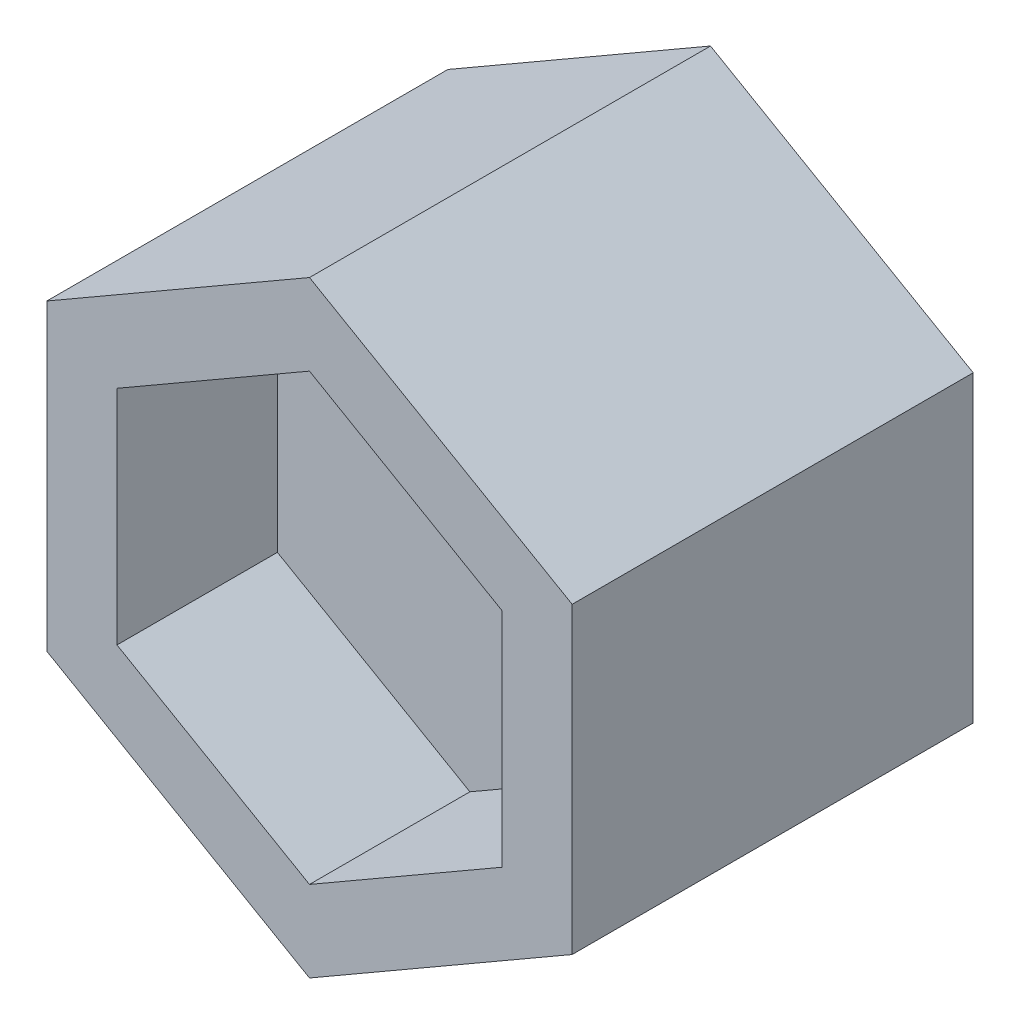
ISO-10303-21;
HEADER;
FILE_DESCRIPTION(('STEP AP214'),'2;1');
FILE_NAME('part.step','',(''),(''),'','','');
FILE_SCHEMA(('AUTOMOTIVE_DESIGN { 1 0 10303 214 1 1 1 1 }'));
ENDSEC;
DATA;
#1=APPLICATION_CONTEXT('core data for automotive mechanical design processes');
#2=APPLICATION_PROTOCOL_DEFINITION('international standard','automotive_design',2000,#1);
#3=PRODUCT_CONTEXT('',#1,'mechanical');
#4=PRODUCT('Part','Part','',(#3));
#5=PRODUCT_RELATED_PRODUCT_CATEGORY('part','',(#4));
#6=PRODUCT_DEFINITION_FORMATION('','',#4);
#7=PRODUCT_DEFINITION_CONTEXT('part definition',#1,'design');
#8=PRODUCT_DEFINITION('design','',#6,#7);
#9=PRODUCT_DEFINITION_SHAPE('','',#8);
#10=(LENGTH_UNIT() NAMED_UNIT(*) SI_UNIT(.MILLI.,.METRE.));
#11=(NAMED_UNIT(*) PLANE_ANGLE_UNIT() SI_UNIT($,.RADIAN.));
#12=(NAMED_UNIT(*) SI_UNIT($,.STERADIAN.) SOLID_ANGLE_UNIT());
#13=UNCERTAINTY_MEASURE_WITH_UNIT(LENGTH_MEASURE(1.E-05),#10,'distance_accuracy_value','');
#14=(GEOMETRIC_REPRESENTATION_CONTEXT(3) GLOBAL_UNCERTAINTY_ASSIGNED_CONTEXT((#13)) GLOBAL_UNIT_ASSIGNED_CONTEXT((#10,
#11,#12)) REPRESENTATION_CONTEXT('',''));
#15=CARTESIAN_POINT('',(0.,0.,0.));
#16=DIRECTION('',(0.,0.,1.));
#17=DIRECTION('',(1.,0.,0.));
#18=AXIS2_PLACEMENT_3D('',#15,#16,#17);
#19=CARTESIAN_POINT('',(0.,11.0851251684408,-10.));
#20=DIRECTION('',(-0.5,0.866025403784438,0.));
#21=DIRECTION('',(-0.866025403784439,-0.5,0.));
#22=AXIS2_PLACEMENT_3D('',#19,#20,#21);
#23=PLANE('',#22);
#24=DIRECTION('',(0.866025403784439,0.5,0.));
#25=VECTOR('',#24,1.);
#26=CARTESIAN_POINT('',(0.,11.0851251684408,-2.));
#27=LINE('',#26,#25);
#28=CARTESIAN_POINT('',(-9.6,5.5425625842204,-2.));
#29=VERTEX_POINT('',#28);
#30=CARTESIAN_POINT('',(0.,11.0851251684408,-2.));
#31=VERTEX_POINT('',#30);
#32=EDGE_CURVE('E310',#29,#31,#27,.T.);
#33=ORIENTED_EDGE('',*,*,#32,.F.);
#34=DIRECTION('',(0.,0.,1.));
#35=VECTOR('',#34,1.);
#36=CARTESIAN_POINT('',(-9.6,5.5425625842204,-10.));
#37=LINE('',#36,#35);
#38=CARTESIAN_POINT('',(-9.6,5.5425625842204,-10.));
#39=VERTEX_POINT('',#38);
#40=EDGE_CURVE('E188',#39,#29,#37,.T.);
#41=ORIENTED_EDGE('',*,*,#40,.F.);
#42=DIRECTION('',(-0.866025403784438,-0.5,0.));
#43=VECTOR('',#42,1.);
#44=CARTESIAN_POINT('',(0.,11.0851251684408,-10.));
#45=LINE('',#44,#43);
#46=CARTESIAN_POINT('',(0.,11.0851251684408,-10.));
#47=VERTEX_POINT('',#46);
#48=EDGE_CURVE('E262',#47,#39,#45,.T.);
#49=ORIENTED_EDGE('',*,*,#48,.F.);
#50=DIRECTION('',(0.,0.,1.));
#51=VECTOR('',#50,1.);
#52=CARTESIAN_POINT('',(0.,11.0851251684408,-10.));
#53=LINE('',#52,#51);
#54=EDGE_CURVE('E201',#47,#31,#53,.T.);
#55=ORIENTED_EDGE('',*,*,#54,.T.);
#56=EDGE_LOOP('',(#33,#41,#49,#55));
#57=FACE_BOUND('',#56,.T.);
#58=ADVANCED_FACE('F39',(#57),#23,.F.);
#59=CARTESIAN_POINT('',(9.6,5.5425625842204,-10.));
#60=DIRECTION('',(0.5,0.866025403784439,0.));
#61=DIRECTION('',(-0.866025403784439,0.5,0.));
#62=AXIS2_PLACEMENT_3D('',#59,#60,#61);
#63=PLANE('',#62);
#64=DIRECTION('',(0.866025403784439,-0.5,0.));
#65=VECTOR('',#64,1.);
#66=CARTESIAN_POINT('',(9.6,5.5425625842204,-2.));
#67=LINE('',#66,#65);
#68=CARTESIAN_POINT('',(9.6,5.5425625842204,-2.));
#69=VERTEX_POINT('',#68);
#70=EDGE_CURVE('E54',#31,#69,#67,.T.);
#71=ORIENTED_EDGE('',*,*,#70,.F.);
#72=ORIENTED_EDGE('',*,*,#54,.F.);
#73=DIRECTION('',(-0.866025403784438,0.5,0.));
#74=VECTOR('',#73,1.);
#75=CARTESIAN_POINT('',(9.6,5.5425625842204,-10.));
#76=LINE('',#75,#74);
#77=CARTESIAN_POINT('',(9.6,5.5425625842204,-10.));
#78=VERTEX_POINT('',#77);
#79=EDGE_CURVE('E277',#78,#47,#76,.T.);
#80=ORIENTED_EDGE('',*,*,#79,.F.);
#81=DIRECTION('',(0.,0.,1.));
#82=VECTOR('',#81,1.);
#83=CARTESIAN_POINT('',(9.6,5.5425625842204,-10.));
#84=LINE('',#83,#82);
#85=EDGE_CURVE('E282',#78,#69,#84,.T.);
#86=ORIENTED_EDGE('',*,*,#85,.T.);
#87=EDGE_LOOP('',(#71,#72,#80,#86));
#88=FACE_BOUND('',#87,.T.);
#89=ADVANCED_FACE('F342',(#88),#63,.F.);
#90=CARTESIAN_POINT('',(9.6,-5.54256258422041,-10.));
#91=DIRECTION('',(1.,0.,0.));
#92=DIRECTION('',(0.,0.,-1.));
#93=AXIS2_PLACEMENT_3D('',#90,#91,#92);
#94=PLANE('',#93);
#95=DIRECTION('',(0.,-1.,0.));
#96=VECTOR('',#95,1.);
#97=CARTESIAN_POINT('',(9.6,-5.54256258422041,-2.));
#98=LINE('',#97,#96);
#99=CARTESIAN_POINT('',(9.6,-5.54256258422041,-2.));
#100=VERTEX_POINT('',#99);
#101=EDGE_CURVE('E62',#69,#100,#98,.T.);
#102=ORIENTED_EDGE('',*,*,#101,.F.);
#103=ORIENTED_EDGE('',*,*,#85,.F.);
#104=DIRECTION('',(0.,1.,0.));
#105=VECTOR('',#104,1.);
#106=CARTESIAN_POINT('',(9.6,-5.54256258422041,-10.));
#107=LINE('',#106,#105);
#108=CARTESIAN_POINT('',(9.6,-5.54256258422041,-10.));
#109=VERTEX_POINT('',#108);
#110=EDGE_CURVE('E274',#109,#78,#107,.T.);
#111=ORIENTED_EDGE('',*,*,#110,.F.);
#112=DIRECTION('',(0.,0.,1.));
#113=VECTOR('',#112,1.);
#114=CARTESIAN_POINT('',(9.6,-5.54256258422041,-10.));
#115=LINE('',#114,#113);
#116=EDGE_CURVE('E284',#109,#100,#115,.T.);
#117=ORIENTED_EDGE('',*,*,#116,.T.);
#118=EDGE_LOOP('',(#102,#103,#111,#117));
#119=FACE_BOUND('',#118,.T.);
#120=ADVANCED_FACE('F353',(#119),#94,.F.);
#121=CARTESIAN_POINT('',(0.,-11.0851251684408,-10.));
#122=DIRECTION('',(0.5,-0.866025403784439,0.));
#123=DIRECTION('',(0.866025403784439,0.5,0.));
#124=AXIS2_PLACEMENT_3D('',#121,#122,#123);
#125=PLANE('',#124);
#126=DIRECTION('',(-0.866025403784439,-0.5,0.));
#127=VECTOR('',#126,1.);
#128=CARTESIAN_POINT('',(0.,-11.0851251684408,-2.));
#129=LINE('',#128,#127);
#130=CARTESIAN_POINT('',(0.,-11.0851251684408,-2.));
#131=VERTEX_POINT('',#130);
#132=EDGE_CURVE('E315',#100,#131,#129,.T.);
#133=ORIENTED_EDGE('',*,*,#132,.F.);
#134=ORIENTED_EDGE('',*,*,#116,.F.);
#135=DIRECTION('',(0.866025403784439,0.5,0.));
#136=VECTOR('',#135,1.);
#137=CARTESIAN_POINT('',(0.,-11.0851251684408,-10.));
#138=LINE('',#137,#136);
#139=CARTESIAN_POINT('',(0.,-11.0851251684408,-10.));
#140=VERTEX_POINT('',#139);
#141=EDGE_CURVE('E271',#140,#109,#138,.T.);
#142=ORIENTED_EDGE('',*,*,#141,.F.);
#143=DIRECTION('',(0.,0.,1.));
#144=VECTOR('',#143,1.);
#145=CARTESIAN_POINT('',(0.,-11.0851251684408,-10.));
#146=LINE('',#145,#144);
#147=EDGE_CURVE('E194',#140,#131,#146,.T.);
#148=ORIENTED_EDGE('',*,*,#147,.T.);
#149=EDGE_LOOP('',(#133,#134,#142,#148));
#150=FACE_BOUND('',#149,.T.);
#151=ADVANCED_FACE('F366',(#150),#125,.F.);
#152=CARTESIAN_POINT('',(-9.6,-5.54256258422041,-10.));
#153=DIRECTION('',(-0.5,-0.866025403784439,0.));
#154=DIRECTION('',(0.866025403784439,-0.5,0.));
#155=AXIS2_PLACEMENT_3D('',#152,#153,#154);
#156=PLANE('',#155);
#157=DIRECTION('',(-0.866025403784439,0.5,0.));
#158=VECTOR('',#157,1.);
#159=CARTESIAN_POINT('',(-9.6,-5.54256258422041,-2.));
#160=LINE('',#159,#158);
#161=CARTESIAN_POINT('',(-9.6,-5.54256258422041,-2.));
#162=VERTEX_POINT('',#161);
#163=EDGE_CURVE('E317',#131,#162,#160,.T.);
#164=ORIENTED_EDGE('',*,*,#163,.F.);
#165=ORIENTED_EDGE('',*,*,#147,.F.);
#166=DIRECTION('',(0.866025403784439,-0.5,0.));
#167=VECTOR('',#166,1.);
#168=CARTESIAN_POINT('',(-9.6,-5.54256258422041,-10.));
#169=LINE('',#168,#167);
#170=CARTESIAN_POINT('',(-9.6,-5.54256258422041,-10.));
#171=VERTEX_POINT('',#170);
#172=EDGE_CURVE('E268',#171,#140,#169,.T.);
#173=ORIENTED_EDGE('',*,*,#172,.F.);
#174=DIRECTION('',(0.,0.,1.));
#175=VECTOR('',#174,1.);
#176=CARTESIAN_POINT('',(-9.6,-5.54256258422041,-10.));
#177=LINE('',#176,#175);
#178=EDGE_CURVE('E187',#171,#162,#177,.T.);
#179=ORIENTED_EDGE('',*,*,#178,.T.);
#180=EDGE_LOOP('',(#164,#165,#173,#179));
#181=FACE_BOUND('',#180,.T.);
#182=ADVANCED_FACE('F363',(#181),#156,.F.);
#183=CARTESIAN_POINT('',(-9.6,5.5425625842204,-10.));
#184=DIRECTION('',(-1.,0.,0.));
#185=DIRECTION('',(0.,0.,1.));
#186=AXIS2_PLACEMENT_3D('',#183,#184,#185);
#187=PLANE('',#186);
#188=DIRECTION('',(0.,1.,0.));
#189=VECTOR('',#188,1.);
#190=CARTESIAN_POINT('',(-9.6,5.5425625842204,-2.));
#191=LINE('',#190,#189);
#192=EDGE_CURVE('E11',#162,#29,#191,.T.);
#193=ORIENTED_EDGE('',*,*,#192,.F.);
#194=ORIENTED_EDGE('',*,*,#178,.F.);
#195=DIRECTION('',(0.,-1.,0.));
#196=VECTOR('',#195,1.);
#197=CARTESIAN_POINT('',(-9.6,5.5425625842204,-10.));
#198=LINE('',#197,#196);
#199=EDGE_CURVE('E265',#39,#171,#198,.T.);
#200=ORIENTED_EDGE('',*,*,#199,.F.);
#201=ORIENTED_EDGE('',*,*,#40,.T.);
#202=EDGE_LOOP('',(#193,#194,#200,#201));
#203=FACE_BOUND('',#202,.T.);
#204=ADVANCED_FACE('F361',(#203),#187,.F.);
#205=CARTESIAN_POINT('',(0.,15.1265770527682,-10.));
#206=DIRECTION('',(-0.5,0.866025403784438,0.));
#207=DIRECTION('',(-0.866025403784439,-0.5,0.));
#208=AXIS2_PLACEMENT_3D('',#205,#206,#207);
#209=PLANE('',#208);
#210=DIRECTION('',(-0.866025403784438,-0.5,0.));
#211=VECTOR('',#210,1.);
#212=CARTESIAN_POINT('',(0.,15.1265770527682,10.));
#213=LINE('',#212,#211);
#214=CARTESIAN_POINT('',(0.,15.1265770527682,10.));
#215=VERTEX_POINT('',#214);
#216=CARTESIAN_POINT('',(-13.1,7.56328852638409,10.));
#217=VERTEX_POINT('',#216);
#218=EDGE_CURVE('E230',#215,#217,#213,.T.);
#219=ORIENTED_EDGE('',*,*,#218,.F.);
#220=DIRECTION('',(0.,0.,1.));
#221=VECTOR('',#220,1.);
#222=CARTESIAN_POINT('',(0.,15.1265770527682,-10.));
#223=LINE('',#222,#221);
#224=CARTESIAN_POINT('',(0.,15.1265770527682,-10.));
#225=VERTEX_POINT('',#224);
#226=EDGE_CURVE('E173',#225,#215,#223,.T.);
#227=ORIENTED_EDGE('',*,*,#226,.F.);
#228=DIRECTION('',(-0.866025403784438,-0.5,0.));
#229=VECTOR('',#228,1.);
#230=CARTESIAN_POINT('',(0.,15.1265770527682,-10.));
#231=LINE('',#230,#229);
#232=CARTESIAN_POINT('',(-13.1,7.56328852638409,-10.));
#233=VERTEX_POINT('',#232);
#234=EDGE_CURVE('E197',#225,#233,#231,.T.);
#235=ORIENTED_EDGE('',*,*,#234,.T.);
#236=DIRECTION('',(0.,0.,1.));
#237=VECTOR('',#236,1.);
#238=CARTESIAN_POINT('',(-13.1,7.56328852638409,-10.));
#239=LINE('',#238,#237);
#240=EDGE_CURVE('E216',#233,#217,#239,.T.);
#241=ORIENTED_EDGE('',*,*,#240,.T.);
#242=EDGE_LOOP('',(#219,#227,#235,#241));
#243=FACE_BOUND('',#242,.T.);
#244=ADVANCED_FACE('F41',(#243),#209,.T.);
#245=CARTESIAN_POINT('',(13.1,7.56328852638409,-10.));
#246=DIRECTION('',(0.5,0.866025403784438,0.));
#247=DIRECTION('',(-0.866025403784439,0.5,0.));
#248=AXIS2_PLACEMENT_3D('',#245,#246,#247);
#249=PLANE('',#248);
#250=DIRECTION('',(-0.866025403784439,0.5,0.));
#251=VECTOR('',#250,1.);
#252=CARTESIAN_POINT('',(13.1,7.56328852638409,10.));
#253=LINE('',#252,#251);
#254=CARTESIAN_POINT('',(13.1,7.56328852638409,10.));
#255=VERTEX_POINT('',#254);
#256=EDGE_CURVE('E247',#255,#215,#253,.T.);
#257=ORIENTED_EDGE('',*,*,#256,.F.);
#258=DIRECTION('',(0.,0.,1.));
#259=VECTOR('',#258,1.);
#260=CARTESIAN_POINT('',(13.1,7.56328852638409,-10.));
#261=LINE('',#260,#259);
#262=CARTESIAN_POINT('',(13.1,7.56328852638409,-10.));
#263=VERTEX_POINT('',#262);
#264=EDGE_CURVE('E218',#263,#255,#261,.T.);
#265=ORIENTED_EDGE('',*,*,#264,.F.);
#266=DIRECTION('',(-0.866025403784439,0.5,0.));
#267=VECTOR('',#266,1.);
#268=CARTESIAN_POINT('',(13.1,7.56328852638409,-10.));
#269=LINE('',#268,#267);
#270=EDGE_CURVE('E213',#263,#225,#269,.T.);
#271=ORIENTED_EDGE('',*,*,#270,.T.);
#272=ORIENTED_EDGE('',*,*,#226,.T.);
#273=EDGE_LOOP('',(#257,#265,#271,#272));
#274=FACE_BOUND('',#273,.T.);
#275=ADVANCED_FACE('F391',(#274),#249,.T.);
#276=CARTESIAN_POINT('',(13.1,-7.5632885263841,-10.));
#277=DIRECTION('',(1.,0.,0.));
#278=DIRECTION('',(0.,0.,-1.));
#279=AXIS2_PLACEMENT_3D('',#276,#277,#278);
#280=PLANE('',#279);
#281=DIRECTION('',(0.,1.,0.));
#282=VECTOR('',#281,1.);
#283=CARTESIAN_POINT('',(13.1,-7.5632885263841,10.));
#284=LINE('',#283,#282);
#285=CARTESIAN_POINT('',(13.1,-7.5632885263841,10.));
#286=VERTEX_POINT('',#285);
#287=EDGE_CURVE('E259',#286,#255,#284,.T.);
#288=ORIENTED_EDGE('',*,*,#287,.F.);
#289=DIRECTION('',(0.,0.,1.));
#290=VECTOR('',#289,1.);
#291=CARTESIAN_POINT('',(13.1,-7.5632885263841,-10.));
#292=LINE('',#291,#290);
#293=CARTESIAN_POINT('',(13.1,-7.5632885263841,-10.));
#294=VERTEX_POINT('',#293);
#295=EDGE_CURVE('E220',#294,#286,#292,.T.);
#296=ORIENTED_EDGE('',*,*,#295,.F.);
#297=DIRECTION('',(0.,1.,0.));
#298=VECTOR('',#297,1.);
#299=CARTESIAN_POINT('',(13.1,-7.5632885263841,-10.));
#300=LINE('',#299,#298);
#301=EDGE_CURVE('E210',#294,#263,#300,.T.);
#302=ORIENTED_EDGE('',*,*,#301,.T.);
#303=ORIENTED_EDGE('',*,*,#264,.T.);
#304=EDGE_LOOP('',(#288,#296,#302,#303));
#305=FACE_BOUND('',#304,.T.);
#306=ADVANCED_FACE('F493',(#305),#280,.T.);
#307=CARTESIAN_POINT('',(0.,-15.1265770527682,-10.));
#308=DIRECTION('',(0.5,-0.866025403784439,0.));
#309=DIRECTION('',(0.866025403784439,0.5,0.));
#310=AXIS2_PLACEMENT_3D('',#307,#308,#309);
#311=PLANE('',#310);
#312=DIRECTION('',(0.866025403784438,0.5,0.));
#313=VECTOR('',#312,1.);
#314=CARTESIAN_POINT('',(0.,-15.1265770527682,10.));
#315=LINE('',#314,#313);
#316=CARTESIAN_POINT('',(0.,-15.1265770527682,10.));
#317=VERTEX_POINT('',#316);
#318=EDGE_CURVE('E256',#317,#286,#315,.T.);
#319=ORIENTED_EDGE('',*,*,#318,.F.);
#320=DIRECTION('',(0.,0.,1.));
#321=VECTOR('',#320,1.);
#322=CARTESIAN_POINT('',(0.,-15.1265770527682,-10.));
#323=LINE('',#322,#321);
#324=CARTESIAN_POINT('',(0.,-15.1265770527682,-10.));
#325=VERTEX_POINT('',#324);
#326=EDGE_CURVE('E222',#325,#317,#323,.T.);
#327=ORIENTED_EDGE('',*,*,#326,.F.);
#328=DIRECTION('',(0.866025403784438,0.5,0.));
#329=VECTOR('',#328,1.);
#330=CARTESIAN_POINT('',(0.,-15.1265770527682,-10.));
#331=LINE('',#330,#329);
#332=EDGE_CURVE('E207',#325,#294,#331,.T.);
#333=ORIENTED_EDGE('',*,*,#332,.T.);
#334=ORIENTED_EDGE('',*,*,#295,.T.);
#335=EDGE_LOOP('',(#319,#327,#333,#334));
#336=FACE_BOUND('',#335,.T.);
#337=ADVANCED_FACE('F484',(#336),#311,.T.);
#338=CARTESIAN_POINT('',(-13.1,-7.5632885263841,-10.));
#339=DIRECTION('',(-0.5,-0.866025403784439,0.));
#340=DIRECTION('',(0.866025403784439,-0.5,0.));
#341=AXIS2_PLACEMENT_3D('',#338,#339,#340);
#342=PLANE('',#341);
#343=DIRECTION('',(0.866025403784439,-0.5,0.));
#344=VECTOR('',#343,1.);
#345=CARTESIAN_POINT('',(-13.1,-7.5632885263841,10.));
#346=LINE('',#345,#344);
#347=CARTESIAN_POINT('',(-13.1,-7.5632885263841,10.));
#348=VERTEX_POINT('',#347);
#349=EDGE_CURVE('E240',#348,#317,#346,.T.);
#350=ORIENTED_EDGE('',*,*,#349,.F.);
#351=DIRECTION('',(0.,0.,1.));
#352=VECTOR('',#351,1.);
#353=CARTESIAN_POINT('',(-13.1,-7.5632885263841,-10.));
#354=LINE('',#353,#352);
#355=CARTESIAN_POINT('',(-13.1,-7.5632885263841,-10.));
#356=VERTEX_POINT('',#355);
#357=EDGE_CURVE('E224',#356,#348,#354,.T.);
#358=ORIENTED_EDGE('',*,*,#357,.F.);
#359=DIRECTION('',(0.866025403784439,-0.5,0.));
#360=VECTOR('',#359,1.);
#361=CARTESIAN_POINT('',(-13.1,-7.5632885263841,-10.));
#362=LINE('',#361,#360);
#363=EDGE_CURVE('E204',#356,#325,#362,.T.);
#364=ORIENTED_EDGE('',*,*,#363,.T.);
#365=ORIENTED_EDGE('',*,*,#326,.T.);
#366=EDGE_LOOP('',(#350,#358,#364,#365));
#367=FACE_BOUND('',#366,.T.);
#368=ADVANCED_FACE('F477',(#367),#342,.T.);
#369=CARTESIAN_POINT('',(-13.1,7.56328852638409,-10.));
#370=DIRECTION('',(-1.,0.,0.));
#371=DIRECTION('',(0.,-1.,0.));
#372=AXIS2_PLACEMENT_3D('',#369,#370,#371);
#373=PLANE('',#372);
#374=DIRECTION('',(0.,-1.,0.));
#375=VECTOR('',#374,1.);
#376=CARTESIAN_POINT('',(-13.1,7.56328852638409,10.));
#377=LINE('',#376,#375);
#378=EDGE_CURVE('E235',#217,#348,#377,.T.);
#379=ORIENTED_EDGE('',*,*,#378,.F.);
#380=ORIENTED_EDGE('',*,*,#240,.F.);
#381=DIRECTION('',(0.,-1.,0.));
#382=VECTOR('',#381,1.);
#383=CARTESIAN_POINT('',(-13.1,7.56328852638409,-10.));
#384=LINE('',#383,#382);
#385=EDGE_CURVE('E200',#233,#356,#384,.T.);
#386=ORIENTED_EDGE('',*,*,#385,.T.);
#387=ORIENTED_EDGE('',*,*,#357,.T.);
#388=EDGE_LOOP('',(#379,#380,#386,#387));
#389=FACE_BOUND('',#388,.T.);
#390=ADVANCED_FACE('F236',(#389),#373,.T.);
#391=CARTESIAN_POINT('',(0.,0.,-10.));
#392=DIRECTION('',(0.,0.,1.));
#393=DIRECTION('',(1.,0.,0.));
#394=AXIS2_PLACEMENT_3D('',#391,#392,#393);
#395=PLANE('',#394);
#396=ORIENTED_EDGE('',*,*,#79,.T.);
#397=ORIENTED_EDGE('',*,*,#48,.T.);
#398=ORIENTED_EDGE('',*,*,#199,.T.);
#399=ORIENTED_EDGE('',*,*,#172,.T.);
#400=ORIENTED_EDGE('',*,*,#141,.T.);
#401=ORIENTED_EDGE('',*,*,#110,.T.);
#402=EDGE_LOOP('',(#396,#397,#398,#399,#400,#401));
#403=FACE_BOUND('',#402,.T.);
#404=ORIENTED_EDGE('',*,*,#234,.F.);
#405=ORIENTED_EDGE('',*,*,#270,.F.);
#406=ORIENTED_EDGE('',*,*,#301,.F.);
#407=ORIENTED_EDGE('',*,*,#332,.F.);
#408=ORIENTED_EDGE('',*,*,#363,.F.);
#409=ORIENTED_EDGE('',*,*,#385,.F.);
#410=EDGE_LOOP('',(#404,#405,#406,#407,#408,#409));
#411=FACE_BOUND('',#410,.T.);
#412=ADVANCED_FACE('F335',(#403,#411),#395,.F.);
#413=CARTESIAN_POINT('',(-9.6,5.5425625842204,2.));
#414=VERTEX_POINT('',#413);
#415=CARTESIAN_POINT('',(-9.6,5.5425625842204,10.));
#416=VERTEX_POINT('',#415);
#417=EDGE_CURVE('E191',#414,#416,#37,.T.);
#418=ORIENTED_EDGE('',*,*,#417,.F.);
#419=DIRECTION('',(0.866025403784439,0.5,0.));
#420=VECTOR('',#419,1.);
#421=CARTESIAN_POINT('',(0.,11.0851251684408,2.));
#422=LINE('',#421,#420);
#423=CARTESIAN_POINT('',(0.,11.0851251684408,2.));
#424=VERTEX_POINT('',#423);
#425=EDGE_CURVE('E169',#414,#424,#422,.T.);
#426=ORIENTED_EDGE('',*,*,#425,.T.);
#427=CARTESIAN_POINT('',(0.,11.0851251684408,10.));
#428=VERTEX_POINT('',#427);
#429=EDGE_CURVE('E281',#424,#428,#53,.T.);
#430=ORIENTED_EDGE('',*,*,#429,.T.);
#431=DIRECTION('',(-0.866025403784438,-0.5,0.));
#432=VECTOR('',#431,1.);
#433=CARTESIAN_POINT('',(0.,11.0851251684408,10.));
#434=LINE('',#433,#432);
#435=EDGE_CURVE('E307',#428,#416,#434,.T.);
#436=ORIENTED_EDGE('',*,*,#435,.T.);
#437=EDGE_LOOP('',(#418,#426,#430,#436));
#438=FACE_BOUND('',#437,.T.);
#439=ADVANCED_FACE('F333',(#438),#23,.F.);
#440=ORIENTED_EDGE('',*,*,#429,.F.);
#441=DIRECTION('',(0.866025403784439,-0.5,0.));
#442=VECTOR('',#441,1.);
#443=CARTESIAN_POINT('',(9.6,5.5425625842204,2.));
#444=LINE('',#443,#442);
#445=CARTESIAN_POINT('',(9.6,5.5425625842204,2.));
#446=VERTEX_POINT('',#445);
#447=EDGE_CURVE('E321',#424,#446,#444,.T.);
#448=ORIENTED_EDGE('',*,*,#447,.T.);
#449=CARTESIAN_POINT('',(9.6,5.5425625842204,10.));
#450=VERTEX_POINT('',#449);
#451=EDGE_CURVE('E283',#446,#450,#84,.T.);
#452=ORIENTED_EDGE('',*,*,#451,.T.);
#453=DIRECTION('',(-0.866025403784438,0.5,0.));
#454=VECTOR('',#453,1.);
#455=CARTESIAN_POINT('',(9.6,5.5425625842204,10.));
#456=LINE('',#455,#454);
#457=EDGE_CURVE('E248',#450,#428,#456,.T.);
#458=ORIENTED_EDGE('',*,*,#457,.T.);
#459=EDGE_LOOP('',(#440,#448,#452,#458));
#460=FACE_BOUND('',#459,.T.);
#461=ADVANCED_FACE('F330',(#460),#63,.F.);
#462=ORIENTED_EDGE('',*,*,#451,.F.);
#463=DIRECTION('',(0.,-1.,0.));
#464=VECTOR('',#463,1.);
#465=CARTESIAN_POINT('',(9.6,-5.54256258422041,2.));
#466=LINE('',#465,#464);
#467=CARTESIAN_POINT('',(9.6,-5.54256258422041,2.));
#468=VERTEX_POINT('',#467);
#469=EDGE_CURVE('E324',#446,#468,#466,.T.);
#470=ORIENTED_EDGE('',*,*,#469,.T.);
#471=CARTESIAN_POINT('',(9.6,-5.54256258422041,10.));
#472=VERTEX_POINT('',#471);
#473=EDGE_CURVE('E285',#468,#472,#115,.T.);
#474=ORIENTED_EDGE('',*,*,#473,.T.);
#475=DIRECTION('',(0.,1.,0.));
#476=VECTOR('',#475,1.);
#477=CARTESIAN_POINT('',(9.6,-5.54256258422041,10.));
#478=LINE('',#477,#476);
#479=EDGE_CURVE('E251',#472,#450,#478,.T.);
#480=ORIENTED_EDGE('',*,*,#479,.T.);
#481=EDGE_LOOP('',(#462,#470,#474,#480));
#482=FACE_BOUND('',#481,.T.);
#483=ADVANCED_FACE('F327',(#482),#94,.F.);
#484=ORIENTED_EDGE('',*,*,#473,.F.);
#485=DIRECTION('',(-0.866025403784439,-0.5,0.));
#486=VECTOR('',#485,1.);
#487=CARTESIAN_POINT('',(0.,-11.0851251684408,2.));
#488=LINE('',#487,#486);
#489=CARTESIAN_POINT('',(0.,-11.0851251684408,2.));
#490=VERTEX_POINT('',#489);
#491=EDGE_CURVE('E181',#468,#490,#488,.T.);
#492=ORIENTED_EDGE('',*,*,#491,.T.);
#493=CARTESIAN_POINT('',(0.,-11.0851251684408,10.));
#494=VERTEX_POINT('',#493);
#495=EDGE_CURVE('E180',#490,#494,#146,.T.);
#496=ORIENTED_EDGE('',*,*,#495,.T.);
#497=DIRECTION('',(0.866025403784439,0.5,0.));
#498=VECTOR('',#497,1.);
#499=CARTESIAN_POINT('',(0.,-11.0851251684408,10.));
#500=LINE('',#499,#498);
#501=EDGE_CURVE('E299',#494,#472,#500,.T.);
#502=ORIENTED_EDGE('',*,*,#501,.T.);
#503=EDGE_LOOP('',(#484,#492,#496,#502));
#504=FACE_BOUND('',#503,.T.);
#505=ADVANCED_FACE('F297',(#504),#125,.F.);
#506=ORIENTED_EDGE('',*,*,#495,.F.);
#507=DIRECTION('',(-0.866025403784439,0.5,0.));
#508=VECTOR('',#507,1.);
#509=CARTESIAN_POINT('',(-9.6,-5.54256258422041,2.));
#510=LINE('',#509,#508);
#511=CARTESIAN_POINT('',(-9.6,-5.54256258422041,2.));
#512=VERTEX_POINT('',#511);
#513=EDGE_CURVE('E166',#490,#512,#510,.T.);
#514=ORIENTED_EDGE('',*,*,#513,.T.);
#515=CARTESIAN_POINT('',(-9.6,-5.54256258422041,10.));
#516=VERTEX_POINT('',#515);
#517=EDGE_CURVE('E178',#512,#516,#177,.T.);
#518=ORIENTED_EDGE('',*,*,#517,.T.);
#519=DIRECTION('',(0.866025403784439,-0.5,0.));
#520=VECTOR('',#519,1.);
#521=CARTESIAN_POINT('',(-9.6,-5.54256258422041,10.));
#522=LINE('',#521,#520);
#523=EDGE_CURVE('E301',#516,#494,#522,.T.);
#524=ORIENTED_EDGE('',*,*,#523,.T.);
#525=EDGE_LOOP('',(#506,#514,#518,#524));
#526=FACE_BOUND('',#525,.T.);
#527=ADVANCED_FACE('F176',(#526),#156,.F.);
#528=ORIENTED_EDGE('',*,*,#517,.F.);
#529=DIRECTION('',(0.,1.,0.));
#530=VECTOR('',#529,1.);
#531=CARTESIAN_POINT('',(-9.6,5.5425625842204,2.));
#532=LINE('',#531,#530);
#533=EDGE_CURVE('E47',#512,#414,#532,.T.);
#534=ORIENTED_EDGE('',*,*,#533,.T.);
#535=ORIENTED_EDGE('',*,*,#417,.T.);
#536=DIRECTION('',(0.,-1.,0.));
#537=VECTOR('',#536,1.);
#538=CARTESIAN_POINT('',(-9.6,5.5425625842204,10.));
#539=LINE('',#538,#537);
#540=EDGE_CURVE('E185',#416,#516,#539,.T.);
#541=ORIENTED_EDGE('',*,*,#540,.T.);
#542=EDGE_LOOP('',(#528,#534,#535,#541));
#543=FACE_BOUND('',#542,.T.);
#544=ADVANCED_FACE('F183',(#543),#187,.F.);
#545=CARTESIAN_POINT('',(0.,0.,10.));
#546=DIRECTION('',(0.,0.,1.));
#547=DIRECTION('',(1.,0.,0.));
#548=AXIS2_PLACEMENT_3D('',#545,#546,#547);
#549=PLANE('',#548);
#550=ORIENTED_EDGE('',*,*,#218,.T.);
#551=ORIENTED_EDGE('',*,*,#378,.T.);
#552=ORIENTED_EDGE('',*,*,#349,.T.);
#553=ORIENTED_EDGE('',*,*,#318,.T.);
#554=ORIENTED_EDGE('',*,*,#287,.T.);
#555=ORIENTED_EDGE('',*,*,#256,.T.);
#556=EDGE_LOOP('',(#550,#551,#552,#553,#554,#555));
#557=FACE_BOUND('',#556,.T.);
#558=ORIENTED_EDGE('',*,*,#540,.F.);
#559=ORIENTED_EDGE('',*,*,#435,.F.);
#560=ORIENTED_EDGE('',*,*,#457,.F.);
#561=ORIENTED_EDGE('',*,*,#479,.F.);
#562=ORIENTED_EDGE('',*,*,#501,.F.);
#563=ORIENTED_EDGE('',*,*,#523,.F.);
#564=EDGE_LOOP('',(#558,#559,#560,#561,#562,#563));
#565=FACE_BOUND('',#564,.T.);
#566=ADVANCED_FACE('F243',(#557,#565),#549,.T.);
#567=CARTESIAN_POINT('',(0.,0.,2.));
#568=DIRECTION('',(0.,0.,1.));
#569=DIRECTION('',(1.,0.,0.));
#570=AXIS2_PLACEMENT_3D('',#567,#568,#569);
#571=PLANE('',#570);
#572=ORIENTED_EDGE('',*,*,#425,.F.);
#573=ORIENTED_EDGE('',*,*,#533,.F.);
#574=ORIENTED_EDGE('',*,*,#513,.F.);
#575=ORIENTED_EDGE('',*,*,#491,.F.);
#576=ORIENTED_EDGE('',*,*,#469,.F.);
#577=ORIENTED_EDGE('',*,*,#447,.F.);
#578=EDGE_LOOP('',(#572,#573,#574,#575,#576,#577));
#579=FACE_BOUND('',#578,.T.);
#580=ADVANCED_FACE('F165',(#579),#571,.T.);
#581=CARTESIAN_POINT('',(0.,0.,-2.));
#582=DIRECTION('',(0.,0.,1.));
#583=DIRECTION('',(1.,0.,0.));
#584=AXIS2_PLACEMENT_3D('',#581,#582,#583);
#585=PLANE('',#584);
#586=ORIENTED_EDGE('',*,*,#192,.T.);
#587=ORIENTED_EDGE('',*,*,#32,.T.);
#588=ORIENTED_EDGE('',*,*,#70,.T.);
#589=ORIENTED_EDGE('',*,*,#101,.T.);
#590=ORIENTED_EDGE('',*,*,#132,.T.);
#591=ORIENTED_EDGE('',*,*,#163,.T.);
#592=EDGE_LOOP('',(#586,#587,#588,#589,#590,#591));
#593=FACE_BOUND('',#592,.T.);
#594=ADVANCED_FACE('F358',(#593),#585,.F.);
#595=CLOSED_SHELL('',(#58,#89,#120,#151,#182,#204,#244,#275,#306,#337,#368,#390,#412,#439,#461,
#483,#505,#527,#544,#566,#580,#594));
#596=MANIFOLD_SOLID_BREP('B2',#595);
#597=ADVANCED_BREP_SHAPE_REPRESENTATION('',(#18,#596),#14);
#598=SHAPE_DEFINITION_REPRESENTATION(#9,#597);
ENDSEC;
END-ISO-10303-21;
